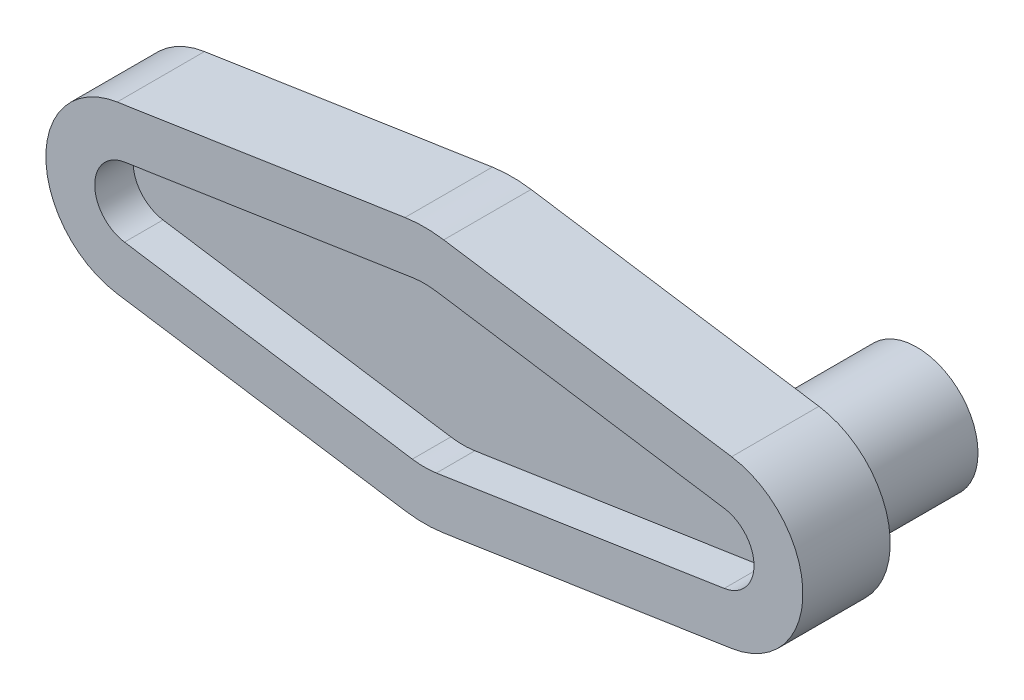
ISO-10303-21;
HEADER;
FILE_DESCRIPTION(('STEP AP214'),'2;1');
FILE_NAME('part.step','',(''),(''),'','','');
FILE_SCHEMA(('AUTOMOTIVE_DESIGN { 1 0 10303 214 1 1 1 1 }'));
ENDSEC;
DATA;
#1=APPLICATION_CONTEXT('core data for automotive mechanical design processes');
#2=APPLICATION_PROTOCOL_DEFINITION('international standard','automotive_design',2000,#1);
#3=PRODUCT_CONTEXT('',#1,'mechanical');
#4=PRODUCT('Part','Part','',(#3));
#5=PRODUCT_RELATED_PRODUCT_CATEGORY('part','',(#4));
#6=PRODUCT_DEFINITION_FORMATION('','',#4);
#7=PRODUCT_DEFINITION_CONTEXT('part definition',#1,'design');
#8=PRODUCT_DEFINITION('design','',#6,#7);
#9=PRODUCT_DEFINITION_SHAPE('','',#8);
#10=(LENGTH_UNIT() NAMED_UNIT(*) SI_UNIT(.MILLI.,.METRE.));
#11=(NAMED_UNIT(*) PLANE_ANGLE_UNIT() SI_UNIT($,.RADIAN.));
#12=(NAMED_UNIT(*) SI_UNIT($,.STERADIAN.) SOLID_ANGLE_UNIT());
#13=UNCERTAINTY_MEASURE_WITH_UNIT(LENGTH_MEASURE(1.E-05),#10,'distance_accuracy_value','');
#14=(GEOMETRIC_REPRESENTATION_CONTEXT(3) GLOBAL_UNCERTAINTY_ASSIGNED_CONTEXT((#13)) GLOBAL_UNIT_ASSIGNED_CONTEXT((#10,
#11,#12)) REPRESENTATION_CONTEXT('',''));
#15=CARTESIAN_POINT('',(0.,0.,0.));
#16=DIRECTION('',(0.,0.,1.));
#17=DIRECTION('',(1.,0.,0.));
#18=AXIS2_PLACEMENT_3D('',#15,#16,#17);
#19=CARTESIAN_POINT('',(-0.509415328671595,-3.3334105627571,-2.));
#20=DIRECTION('',(-0.151067206207441,-0.988523494515269,0.));
#21=DIRECTION('',(0.988523494515269,-0.151067206207441,0.));
#22=AXIS2_PLACEMENT_3D('',#19,#20,#21);
#23=PLANE('',#22);
#24=DIRECTION('',(-0.988523494515269,0.151067206207441,0.));
#25=VECTOR('',#24,1.);
#26=CARTESIAN_POINT('',(-0.509415328671595,-3.3334105627571,0.));
#27=LINE('',#26,#25);
#28=CARTESIAN_POINT('',(4.42533710233228,-4.08754464982064,0.));
#29=VERTEX_POINT('',#28);
#30=CARTESIAN_POINT('',(-10.5365026242203,-1.80106047442719,0.));
#31=VERTEX_POINT('',#30);
#32=EDGE_CURVE('E218',#29,#31,#27,.T.);
#33=ORIENTED_EDGE('',*,*,#32,.F.);
#34=DIRECTION('',(0.,0.,1.));
#35=VECTOR('',#34,1.);
#36=CARTESIAN_POINT('',(4.42533710233228,-4.08754464982064,-2.));
#37=LINE('',#36,#35);
#38=CARTESIAN_POINT('',(4.42533710233228,-4.08754464982064,-2.));
#39=VERTEX_POINT('',#38);
#40=EDGE_CURVE('E119',#39,#29,#37,.T.);
#41=ORIENTED_EDGE('',*,*,#40,.F.);
#42=DIRECTION('',(-0.988523494515269,0.151067206207441,0.));
#43=VECTOR('',#42,1.);
#44=CARTESIAN_POINT('',(-0.509415328671595,-3.3334105627571,-2.));
#45=LINE('',#44,#43);
#46=CARTESIAN_POINT('',(-10.5365026242203,-1.80106047442719,-2.));
#47=VERTEX_POINT('',#46);
#48=EDGE_CURVE('E124',#39,#47,#45,.T.);
#49=ORIENTED_EDGE('',*,*,#48,.T.);
#50=DIRECTION('',(0.,0.,1.));
#51=VECTOR('',#50,1.);
#52=CARTESIAN_POINT('',(-10.5365026242203,-1.80106047442719,-2.));
#53=LINE('',#52,#51);
#54=EDGE_CURVE('E11',#47,#31,#53,.T.);
#55=ORIENTED_EDGE('',*,*,#54,.T.);
#56=EDGE_LOOP('',(#33,#41,#49,#55));
#57=FACE_BOUND('',#56,.T.);
#58=ADVANCED_FACE('F43',(#57),#23,.F.);
#59=CARTESIAN_POINT('',(-10.2609482374131,0.00205743722317206,-2.));
#60=DIRECTION('',(0.,0.,1.));
#61=DIRECTION('',(-1.,0.,0.));
#62=AXIS2_PLACEMENT_3D('',#59,#60,#61);
#63=CYLINDRICAL_SURFACE('',#62,1.82405165042085);
#64=CARTESIAN_POINT('',(-10.2609482374131,0.00205743722317206,0.));
#65=DIRECTION('',(0.,0.,1.));
#66=DIRECTION('',(1.,0.,0.));
#67=AXIS2_PLACEMENT_3D('',#64,#65,#66);
#68=CIRCLE('',#67,1.82405165042085);
#69=CARTESIAN_POINT('',(-10.5360180196135,1.80524934002311,0.));
#70=VERTEX_POINT('',#69);
#71=EDGE_CURVE('E220',#31,#70,#68,.F.);
#72=ORIENTED_EDGE('',*,*,#71,.F.);
#73=ORIENTED_EDGE('',*,*,#54,.F.);
#74=CARTESIAN_POINT('',(-10.2609482374131,0.00205743722317206,-2.));
#75=DIRECTION('',(0.,0.,1.));
#76=DIRECTION('',(1.,0.,0.));
#77=AXIS2_PLACEMENT_3D('',#74,#75,#76);
#78=CIRCLE('',#77,1.82405165042085);
#79=CARTESIAN_POINT('',(-10.5360180196135,1.80524934002311,-2.));
#80=VERTEX_POINT('',#79);
#81=EDGE_CURVE('E250',#47,#80,#78,.F.);
#82=ORIENTED_EDGE('',*,*,#81,.T.);
#83=DIRECTION('',(0.,0.,1.));
#84=VECTOR('',#83,1.);
#85=CARTESIAN_POINT('',(-10.5360180196135,1.80524934002311,-2.));
#86=LINE('',#85,#84);
#87=EDGE_CURVE('E53',#80,#70,#86,.T.);
#88=ORIENTED_EDGE('',*,*,#87,.T.);
#89=EDGE_LOOP('',(#72,#73,#82,#88));
#90=FACE_BOUND('',#89,.T.);
#91=ADVANCED_FACE('F247',(#90),#63,.F.);
#92=CARTESIAN_POINT('',(-0.508721767831144,3.33487366439654,-2.));
#93=DIRECTION('',(-0.150801531380359,0.988564058689845,0.));
#94=DIRECTION('',(-0.988564058689845,-0.150801531380359,0.));
#95=AXIS2_PLACEMENT_3D('',#92,#93,#94);
#96=PLANE('',#95);
#97=DIRECTION('',(0.988564058689845,0.150801531380359,0.));
#98=VECTOR('',#97,1.);
#99=CARTESIAN_POINT('',(-0.508721767831144,3.33487366439654,0.));
#100=LINE('',#99,#98);
#101=CARTESIAN_POINT('',(4.42643566774227,4.08771238268251,0.));
#102=VERTEX_POINT('',#101);
#103=EDGE_CURVE('E223',#70,#102,#100,.T.);
#104=ORIENTED_EDGE('',*,*,#103,.F.);
#105=ORIENTED_EDGE('',*,*,#87,.F.);
#106=DIRECTION('',(0.988564058689845,0.150801531380359,0.));
#107=VECTOR('',#106,1.);
#108=CARTESIAN_POINT('',(-0.508721767831144,3.33487366439654,-2.));
#109=LINE('',#108,#107);
#110=CARTESIAN_POINT('',(4.42643566774227,4.08771238268251,-2.));
#111=VERTEX_POINT('',#110);
#112=EDGE_CURVE('E254',#80,#111,#109,.T.);
#113=ORIENTED_EDGE('',*,*,#112,.T.);
#114=DIRECTION('',(0.,0.,1.));
#115=VECTOR('',#114,1.);
#116=CARTESIAN_POINT('',(4.42643566774227,4.08771238268251,-2.));
#117=LINE('',#116,#115);
#118=EDGE_CURVE('E151',#111,#102,#117,.T.);
#119=ORIENTED_EDGE('',*,*,#118,.T.);
#120=EDGE_LOOP('',(#104,#105,#113,#119));
#121=FACE_BOUND('',#120,.T.);
#122=ADVANCED_FACE('F242',(#121),#96,.F.);
#123=CARTESIAN_POINT('',(5.05000000000001,0.,-2.));
#124=DIRECTION('',(0.,0.,1.));
#125=DIRECTION('',(-1.,0.,0.));
#126=AXIS2_PLACEMENT_3D('',#123,#124,#125);
#127=CYLINDRICAL_SURFACE('',#126,4.135);
#128=CARTESIAN_POINT('',(5.05000000000001,0.,0.));
#129=DIRECTION('',(0.,0.,1.));
#130=DIRECTION('',(1.,0.,0.));
#131=AXIS2_PLACEMENT_3D('',#128,#129,#130);
#132=CIRCLE('',#131,4.135);
#133=CARTESIAN_POINT('',(5.67356433225773,4.08771238268252,0.));
#134=VERTEX_POINT('',#133);
#135=EDGE_CURVE('E226',#134,#102,#132,.T.);
#136=ORIENTED_EDGE('',*,*,#135,.T.);
#137=ORIENTED_EDGE('',*,*,#118,.F.);
#138=CARTESIAN_POINT('',(5.05000000000001,0.,-2.));
#139=DIRECTION('',(0.,0.,1.));
#140=DIRECTION('',(1.,0.,0.));
#141=AXIS2_PLACEMENT_3D('',#138,#139,#140);
#142=CIRCLE('',#141,4.135);
#143=CARTESIAN_POINT('',(5.67356433225773,4.08771238268252,-2.));
#144=VERTEX_POINT('',#143);
#145=EDGE_CURVE('E239',#144,#111,#142,.T.);
#146=ORIENTED_EDGE('',*,*,#145,.F.);
#147=DIRECTION('',(0.,0.,1.));
#148=VECTOR('',#147,1.);
#149=CARTESIAN_POINT('',(5.67356433225773,4.08771238268252,-2.));
#150=LINE('',#149,#148);
#151=EDGE_CURVE('E148',#144,#134,#150,.T.);
#152=ORIENTED_EDGE('',*,*,#151,.T.);
#153=EDGE_LOOP('',(#136,#137,#146,#152));
#154=FACE_BOUND('',#153,.T.);
#155=ADVANCED_FACE('F236',(#154),#127,.F.);
#156=CARTESIAN_POINT('',(0.738406896684348,4.84055110096841,-2.));
#157=DIRECTION('',(-0.150801531380345,-0.988564058689847,0.));
#158=DIRECTION('',(0.988564058689847,-0.150801531380345,0.));
#159=AXIS2_PLACEMENT_3D('',#156,#157,#158);
#160=PLANE('',#159);
#161=DIRECTION('',(-0.988564058689847,0.150801531380345,0.));
#162=VECTOR('',#161,1.);
#163=CARTESIAN_POINT('',(0.738406896684348,4.84055110096841,0.));
#164=LINE('',#163,#162);
#165=CARTESIAN_POINT('',(20.6360180196135,1.80524934002333,0.));
#166=VERTEX_POINT('',#165);
#167=EDGE_CURVE('E139',#166,#134,#164,.T.);
#168=ORIENTED_EDGE('',*,*,#167,.T.);
#169=ORIENTED_EDGE('',*,*,#151,.F.);
#170=DIRECTION('',(-0.988564058689847,0.150801531380345,0.));
#171=VECTOR('',#170,1.);
#172=CARTESIAN_POINT('',(0.738406896684348,4.84055110096841,-2.));
#173=LINE('',#172,#171);
#174=CARTESIAN_POINT('',(20.6360180196135,1.80524934002333,-2.));
#175=VERTEX_POINT('',#174);
#176=EDGE_CURVE('E260',#175,#144,#173,.T.);
#177=ORIENTED_EDGE('',*,*,#176,.F.);
#178=DIRECTION('',(0.,0.,1.));
#179=VECTOR('',#178,1.);
#180=CARTESIAN_POINT('',(20.6360180196135,1.80524934002333,-2.));
#181=LINE('',#180,#179);
#182=EDGE_CURVE('E145',#175,#166,#181,.T.);
#183=ORIENTED_EDGE('',*,*,#182,.T.);
#184=EDGE_LOOP('',(#168,#169,#177,#183));
#185=FACE_BOUND('',#184,.T.);
#186=ADVANCED_FACE('F229',(#185),#160,.T.);
#187=CARTESIAN_POINT('',(20.3609482374132,0.00205743722338716,-2.));
#188=DIRECTION('',(0.,0.,1.));
#189=DIRECTION('',(-1.,0.,0.));
#190=AXIS2_PLACEMENT_3D('',#187,#188,#189);
#191=CYLINDRICAL_SURFACE('',#190,1.82405165042085);
#192=CARTESIAN_POINT('',(20.3609482374132,0.00205743722338716,0.));
#193=DIRECTION('',(0.,0.,1.));
#194=DIRECTION('',(1.,0.,0.));
#195=AXIS2_PLACEMENT_3D('',#192,#193,#194);
#196=CIRCLE('',#195,1.82405165042085);
#197=CARTESIAN_POINT('',(20.6365026242203,-1.80106047442697,0.));
#198=VERTEX_POINT('',#197);
#199=EDGE_CURVE('E137',#198,#166,#196,.T.);
#200=ORIENTED_EDGE('',*,*,#199,.T.);
#201=ORIENTED_EDGE('',*,*,#182,.F.);
#202=CARTESIAN_POINT('',(20.3609482374132,0.00205743722338716,-2.));
#203=DIRECTION('',(0.,0.,1.));
#204=DIRECTION('',(1.,0.,0.));
#205=AXIS2_PLACEMENT_3D('',#202,#203,#204);
#206=CIRCLE('',#205,1.82405165042085);
#207=CARTESIAN_POINT('',(20.6365026242203,-1.80106047442697,-2.));
#208=VERTEX_POINT('',#207);
#209=EDGE_CURVE('E263',#208,#175,#206,.T.);
#210=ORIENTED_EDGE('',*,*,#209,.F.);
#211=DIRECTION('',(0.,0.,1.));
#212=VECTOR('',#211,1.);
#213=CARTESIAN_POINT('',(20.6365026242203,-1.80106047442697,-2.));
#214=LINE('',#213,#212);
#215=EDGE_CURVE('E132',#208,#198,#214,.T.);
#216=ORIENTED_EDGE('',*,*,#215,.T.);
#217=EDGE_LOOP('',(#200,#201,#210,#216));
#218=FACE_BOUND('',#217,.T.);
#219=ADVANCED_FACE('F272',(#218),#191,.F.);
#220=CARTESIAN_POINT('',(0.739910466664021,-4.84167873688423,-2.));
#221=DIRECTION('',(-0.151067206207455,0.988523494515267,0.));
#222=DIRECTION('',(-0.988523494515267,-0.151067206207455,0.));
#223=AXIS2_PLACEMENT_3D('',#220,#221,#222);
#224=PLANE('',#223);
#225=DIRECTION('',(0.988523494515267,0.151067206207455,0.));
#226=VECTOR('',#225,1.);
#227=CARTESIAN_POINT('',(0.739910466664021,-4.84167873688423,0.));
#228=LINE('',#227,#226);
#229=CARTESIAN_POINT('',(5.67466289766783,-4.08754464982063,0.));
#230=VERTEX_POINT('',#229);
#231=EDGE_CURVE('E125',#230,#198,#228,.T.);
#232=ORIENTED_EDGE('',*,*,#231,.T.);
#233=ORIENTED_EDGE('',*,*,#215,.F.);
#234=DIRECTION('',(0.988523494515267,0.151067206207455,0.));
#235=VECTOR('',#234,1.);
#236=CARTESIAN_POINT('',(0.739910466664021,-4.84167873688423,-2.));
#237=LINE('',#236,#235);
#238=CARTESIAN_POINT('',(5.67466289766783,-4.08754464982063,-2.));
#239=VERTEX_POINT('',#238);
#240=EDGE_CURVE('E131',#239,#208,#237,.T.);
#241=ORIENTED_EDGE('',*,*,#240,.F.);
#242=DIRECTION('',(0.,0.,1.));
#243=VECTOR('',#242,1.);
#244=CARTESIAN_POINT('',(5.67466289766783,-4.08754464982063,-2.));
#245=LINE('',#244,#243);
#246=EDGE_CURVE('E116',#239,#230,#245,.T.);
#247=ORIENTED_EDGE('',*,*,#246,.T.);
#248=EDGE_LOOP('',(#232,#233,#241,#247));
#249=FACE_BOUND('',#248,.T.);
#250=ADVANCED_FACE('F128',(#249),#224,.T.);
#251=CARTESIAN_POINT('',(-10.2609482374131,0.00205743722317206,-2.));
#252=DIRECTION('',(0.,0.,1.));
#253=DIRECTION('',(-1.,0.,0.));
#254=AXIS2_PLACEMENT_3D('',#251,#252,#253);
#255=CYLINDRICAL_SURFACE('',#254,4.36405165042085);
#256=CARTESIAN_POINT('',(-10.2609482374131,0.00205743722317206,0.));
#257=DIRECTION('',(0.,0.,1.));
#258=DIRECTION('',(1.,0.,0.));
#259=AXIS2_PLACEMENT_3D('',#256,#257,#258);
#260=CIRCLE('',#259,4.36405165042085);
#261=CARTESIAN_POINT('',(-10.9202133279872,-4.31191015049597,0.));
#262=VERTEX_POINT('',#261);
#263=CARTESIAN_POINT('',(-10.9190539093196,4.31620204909532,0.));
#264=VERTEX_POINT('',#263);
#265=EDGE_CURVE('E186',#262,#264,#260,.F.);
#266=ORIENTED_EDGE('',*,*,#265,.T.);
#267=DIRECTION('',(0.,0.,1.));
#268=VECTOR('',#267,1.);
#269=CARTESIAN_POINT('',(-10.9190539093196,4.31620204909532,-2.));
#270=LINE('',#269,#268);
#271=CARTESIAN_POINT('',(-10.9190539093196,4.31620204909532,-4.54));
#272=VERTEX_POINT('',#271);
#273=EDGE_CURVE('E156',#272,#264,#270,.T.);
#274=ORIENTED_EDGE('',*,*,#273,.F.);
#275=CARTESIAN_POINT('',(-10.2609482374131,0.00205743722317206,-4.54));
#276=DIRECTION('',(0.,0.,1.));
#277=DIRECTION('',(1.,0.,0.));
#278=AXIS2_PLACEMENT_3D('',#275,#276,#277);
#279=CIRCLE('',#278,4.36405165042085);
#280=CARTESIAN_POINT('',(-10.9202133279872,-4.31191015049597,-4.54));
#281=VERTEX_POINT('',#280);
#282=EDGE_CURVE('E189',#272,#281,#279,.T.);
#283=ORIENTED_EDGE('',*,*,#282,.T.);
#284=DIRECTION('',(0.,0.,1.));
#285=VECTOR('',#284,1.);
#286=CARTESIAN_POINT('',(-10.9202133279872,-4.31191015049597,-2.));
#287=LINE('',#286,#285);
#288=EDGE_CURVE('E47',#281,#262,#287,.T.);
#289=ORIENTED_EDGE('',*,*,#288,.T.);
#290=EDGE_LOOP('',(#266,#274,#283,#289));
#291=FACE_BOUND('',#290,.T.);
#292=ADVANCED_FACE('F45',(#291),#255,.T.);
#293=CARTESIAN_POINT('',(-0.893126032438493,-5.84426023882588,-2.));
#294=DIRECTION('',(-0.151067206207441,-0.988523494515269,0.));
#295=DIRECTION('',(0.988523494515269,-0.151067206207441,0.));
#296=AXIS2_PLACEMENT_3D('',#293,#294,#295);
#297=PLANE('',#296);
#298=DIRECTION('',(-0.988523494515269,0.151067206207441,0.));
#299=VECTOR('',#298,1.);
#300=CARTESIAN_POINT('',(-0.893126032438493,-5.84426023882588,0.));
#301=LINE('',#300,#299);
#302=CARTESIAN_POINT('',(4.04162639856539,-6.59839432588942,0.));
#303=VERTEX_POINT('',#302);
#304=EDGE_CURVE('E192',#303,#262,#301,.T.);
#305=ORIENTED_EDGE('',*,*,#304,.T.);
#306=ORIENTED_EDGE('',*,*,#288,.F.);
#307=DIRECTION('',(0.988523494515269,-0.151067206207441,0.));
#308=VECTOR('',#307,1.);
#309=CARTESIAN_POINT('',(-0.893126032438493,-5.84426023882588,-4.54));
#310=LINE('',#309,#308);
#311=CARTESIAN_POINT('',(4.04162639856538,-6.59839432588942,-4.54));
#312=VERTEX_POINT('',#311);
#313=EDGE_CURVE('E308',#281,#312,#310,.T.);
#314=ORIENTED_EDGE('',*,*,#313,.T.);
#315=DIRECTION('',(0.,0.,1.));
#316=VECTOR('',#315,1.);
#317=CARTESIAN_POINT('',(4.04162639856539,-6.59839432588942,-2.));
#318=LINE('',#317,#316);
#319=EDGE_CURVE('E173',#312,#303,#318,.T.);
#320=ORIENTED_EDGE('',*,*,#319,.T.);
#321=EDGE_LOOP('',(#305,#306,#314,#320));
#322=FACE_BOUND('',#321,.T.);
#323=ADVANCED_FACE('F337',(#322),#297,.T.);
#324=CARTESIAN_POINT('',(5.05000000000001,0.,-2.));
#325=DIRECTION('',(0.,0.,1.));
#326=DIRECTION('',(-1.,0.,0.));
#327=AXIS2_PLACEMENT_3D('',#324,#325,#326);
#328=CYLINDRICAL_SURFACE('',#327,6.675);
#329=CARTESIAN_POINT('',(5.05000000000001,0.,0.));
#330=DIRECTION('',(0.,0.,1.));
#331=DIRECTION('',(1.,0.,0.));
#332=AXIS2_PLACEMENT_3D('',#329,#330,#331);
#333=CIRCLE('',#332,6.675);
#334=CARTESIAN_POINT('',(6.05837360143477,-6.59839432588941,0.));
#335=VERTEX_POINT('',#334);
#336=EDGE_CURVE('E197',#303,#335,#333,.T.);
#337=ORIENTED_EDGE('',*,*,#336,.F.);
#338=ORIENTED_EDGE('',*,*,#319,.F.);
#339=CARTESIAN_POINT('',(5.05000000000001,0.,-4.54));
#340=DIRECTION('',(0.,0.,1.));
#341=DIRECTION('',(1.,0.,0.));
#342=AXIS2_PLACEMENT_3D('',#339,#340,#341);
#343=CIRCLE('',#342,6.675);
#344=CARTESIAN_POINT('',(6.05837360143477,-6.59839432588941,-4.54));
#345=VERTEX_POINT('',#344);
#346=EDGE_CURVE('E310',#312,#345,#343,.T.);
#347=ORIENTED_EDGE('',*,*,#346,.T.);
#348=DIRECTION('',(0.,0.,1.));
#349=VECTOR('',#348,1.);
#350=CARTESIAN_POINT('',(6.05837360143477,-6.59839432588941,-2.));
#351=LINE('',#350,#349);
#352=EDGE_CURVE('E171',#345,#335,#351,.T.);
#353=ORIENTED_EDGE('',*,*,#352,.T.);
#354=EDGE_LOOP('',(#337,#338,#347,#353));
#355=FACE_BOUND('',#354,.T.);
#356=ADVANCED_FACE('F336',(#355),#328,.T.);
#357=CARTESIAN_POINT('',(1.12362117043096,-7.35252841295301,-2.));
#358=DIRECTION('',(-0.151067206207455,0.988523494515267,0.));
#359=DIRECTION('',(-0.988523494515267,-0.151067206207455,0.));
#360=AXIS2_PLACEMENT_3D('',#357,#358,#359);
#361=PLANE('',#360);
#362=DIRECTION('',(0.988523494515267,0.151067206207455,0.));
#363=VECTOR('',#362,1.);
#364=CARTESIAN_POINT('',(1.12362117043096,-7.35252841295301,0.));
#365=LINE('',#364,#363);
#366=CARTESIAN_POINT('',(21.0202133279873,-4.31191015049575,0.));
#367=VERTEX_POINT('',#366);
#368=EDGE_CURVE('E206',#335,#367,#365,.T.);
#369=ORIENTED_EDGE('',*,*,#368,.F.);
#370=ORIENTED_EDGE('',*,*,#352,.F.);
#371=DIRECTION('',(0.988523494515267,0.151067206207455,0.));
#372=VECTOR('',#371,1.);
#373=CARTESIAN_POINT('',(1.12362117043096,-7.35252841295301,-4.54));
#374=LINE('',#373,#372);
#375=CARTESIAN_POINT('',(21.0202133279873,-4.31191015049575,-4.54));
#376=VERTEX_POINT('',#375);
#377=EDGE_CURVE('E316',#345,#376,#374,.T.);
#378=ORIENTED_EDGE('',*,*,#377,.T.);
#379=DIRECTION('',(0.,0.,1.));
#380=VECTOR('',#379,1.);
#381=CARTESIAN_POINT('',(21.0202133279873,-4.31191015049575,-2.));
#382=LINE('',#381,#380);
#383=EDGE_CURVE('E168',#376,#367,#382,.T.);
#384=ORIENTED_EDGE('',*,*,#383,.T.);
#385=EDGE_LOOP('',(#369,#370,#378,#384));
#386=FACE_BOUND('',#385,.T.);
#387=ADVANCED_FACE('F334',(#386),#361,.F.);
#388=CARTESIAN_POINT('',(20.3609482374132,0.00205743722338716,-2.));
#389=DIRECTION('',(0.,0.,1.));
#390=DIRECTION('',(-1.,0.,0.));
#391=AXIS2_PLACEMENT_3D('',#388,#389,#390);
#392=CYLINDRICAL_SURFACE('',#391,4.36405165042085);
#393=CARTESIAN_POINT('',(20.3609482374132,0.00205743722338716,0.));
#394=DIRECTION('',(0.,0.,1.));
#395=DIRECTION('',(1.,0.,0.));
#396=AXIS2_PLACEMENT_3D('',#393,#394,#395);
#397=CIRCLE('',#396,4.36405165042085);
#398=CARTESIAN_POINT('',(21.0190539093196,4.31620204909554,0.));
#399=VERTEX_POINT('',#398);
#400=EDGE_CURVE('E209',#367,#399,#397,.T.);
#401=ORIENTED_EDGE('',*,*,#400,.F.);
#402=ORIENTED_EDGE('',*,*,#383,.F.);
#403=CARTESIAN_POINT('',(20.3609482374132,0.00205743722338716,-4.54));
#404=DIRECTION('',(0.,0.,1.));
#405=DIRECTION('',(1.,0.,0.));
#406=AXIS2_PLACEMENT_3D('',#403,#404,#405);
#407=CIRCLE('',#406,4.36405165042085);
#408=CARTESIAN_POINT('',(21.0190539093196,4.31620204909554,-4.54));
#409=VERTEX_POINT('',#408);
#410=EDGE_CURVE('E319',#376,#409,#407,.T.);
#411=ORIENTED_EDGE('',*,*,#410,.T.);
#412=DIRECTION('',(0.,0.,1.));
#413=VECTOR('',#412,1.);
#414=CARTESIAN_POINT('',(21.0190539093196,4.31620204909554,-2.));
#415=LINE('',#414,#413);
#416=EDGE_CURVE('E165',#409,#399,#415,.T.);
#417=ORIENTED_EDGE('',*,*,#416,.T.);
#418=EDGE_LOOP('',(#401,#402,#411,#417));
#419=FACE_BOUND('',#418,.T.);
#420=ADVANCED_FACE('F331',(#419),#392,.T.);
#421=CARTESIAN_POINT('',(1.12144278639042,7.35150381004062,-2.));
#422=DIRECTION('',(-0.150801531380345,-0.988564058689847,0.));
#423=DIRECTION('',(0.988564058689847,-0.150801531380345,0.));
#424=AXIS2_PLACEMENT_3D('',#421,#422,#423);
#425=PLANE('',#424);
#426=DIRECTION('',(-0.988564058689847,0.150801531380345,0.));
#427=VECTOR('',#426,1.);
#428=CARTESIAN_POINT('',(1.12144278639042,7.35150381004062,0.));
#429=LINE('',#428,#427);
#430=CARTESIAN_POINT('',(6.05660022196381,6.59866509175473,0.));
#431=VERTEX_POINT('',#430);
#432=EDGE_CURVE('E212',#399,#431,#429,.T.);
#433=ORIENTED_EDGE('',*,*,#432,.F.);
#434=ORIENTED_EDGE('',*,*,#416,.F.);
#435=DIRECTION('',(-0.988564058689847,0.150801531380345,0.));
#436=VECTOR('',#435,1.);
#437=CARTESIAN_POINT('',(1.12144278639042,7.35150381004062,-4.54));
#438=LINE('',#437,#436);
#439=CARTESIAN_POINT('',(6.05660022196381,6.59866509175473,-4.54));
#440=VERTEX_POINT('',#439);
#441=EDGE_CURVE('E200',#409,#440,#438,.T.);
#442=ORIENTED_EDGE('',*,*,#441,.T.);
#443=DIRECTION('',(0.,0.,1.));
#444=VECTOR('',#443,1.);
#445=CARTESIAN_POINT('',(6.05660022196381,6.59866509175473,-2.));
#446=LINE('',#445,#444);
#447=EDGE_CURVE('E162',#440,#431,#446,.T.);
#448=ORIENTED_EDGE('',*,*,#447,.T.);
#449=EDGE_LOOP('',(#433,#434,#442,#448));
#450=FACE_BOUND('',#449,.T.);
#451=ADVANCED_FACE('F325',(#450),#425,.F.);
#452=CARTESIAN_POINT('',(5.05000000000001,0.,-2.));
#453=DIRECTION('',(0.,0.,1.));
#454=DIRECTION('',(-1.,0.,0.));
#455=AXIS2_PLACEMENT_3D('',#452,#453,#454);
#456=CYLINDRICAL_SURFACE('',#455,6.675);
#457=CARTESIAN_POINT('',(5.05000000000001,0.,0.));
#458=DIRECTION('',(0.,0.,1.));
#459=DIRECTION('',(1.,0.,0.));
#460=AXIS2_PLACEMENT_3D('',#457,#458,#459);
#461=CIRCLE('',#460,6.675);
#462=CARTESIAN_POINT('',(4.04339977803616,6.59866509175472,0.));
#463=VERTEX_POINT('',#462);
#464=EDGE_CURVE('E215',#431,#463,#461,.T.);
#465=ORIENTED_EDGE('',*,*,#464,.F.);
#466=ORIENTED_EDGE('',*,*,#447,.F.);
#467=CARTESIAN_POINT('',(5.05000000000001,0.,-4.54));
#468=DIRECTION('',(0.,0.,1.));
#469=DIRECTION('',(1.,0.,0.));
#470=AXIS2_PLACEMENT_3D('',#467,#468,#469);
#471=CIRCLE('',#470,6.675);
#472=CARTESIAN_POINT('',(4.04339977803616,6.59866509175472,-4.54));
#473=VERTEX_POINT('',#472);
#474=EDGE_CURVE('E195',#440,#473,#471,.T.);
#475=ORIENTED_EDGE('',*,*,#474,.T.);
#476=DIRECTION('',(0.,0.,1.));
#477=VECTOR('',#476,1.);
#478=CARTESIAN_POINT('',(4.04339977803616,6.59866509175472,-2.));
#479=LINE('',#478,#477);
#480=EDGE_CURVE('E159',#473,#463,#479,.T.);
#481=ORIENTED_EDGE('',*,*,#480,.T.);
#482=EDGE_LOOP('',(#465,#466,#475,#481));
#483=FACE_BOUND('',#482,.T.);
#484=ADVANCED_FACE('F329',(#483),#456,.T.);
#485=CARTESIAN_POINT('',(-0.891757657537256,5.84582637346875,-2.));
#486=DIRECTION('',(-0.150801531380359,0.988564058689845,0.));
#487=DIRECTION('',(-0.988564058689845,-0.150801531380359,0.));
#488=AXIS2_PLACEMENT_3D('',#485,#486,#487);
#489=PLANE('',#488);
#490=DIRECTION('',(0.988564058689845,0.150801531380359,0.));
#491=VECTOR('',#490,1.);
#492=CARTESIAN_POINT('',(-0.891757657537256,5.84582637346875,0.));
#493=LINE('',#492,#491);
#494=EDGE_CURVE('E194',#264,#463,#493,.T.);
#495=ORIENTED_EDGE('',*,*,#494,.T.);
#496=ORIENTED_EDGE('',*,*,#480,.F.);
#497=DIRECTION('',(-0.988564058689845,-0.150801531380359,0.));
#498=VECTOR('',#497,1.);
#499=CARTESIAN_POINT('',(-0.891757657537256,5.84582637346875,-4.54));
#500=LINE('',#499,#498);
#501=EDGE_CURVE('E302',#473,#272,#500,.T.);
#502=ORIENTED_EDGE('',*,*,#501,.T.);
#503=ORIENTED_EDGE('',*,*,#273,.T.);
#504=EDGE_LOOP('',(#495,#496,#502,#503));
#505=FACE_BOUND('',#504,.T.);
#506=ADVANCED_FACE('F303',(#505),#489,.T.);
#507=CARTESIAN_POINT('',(5.05000000000001,0.,-2.));
#508=DIRECTION('',(0.,0.,1.));
#509=DIRECTION('',(-1.,0.,0.));
#510=AXIS2_PLACEMENT_3D('',#507,#508,#509);
#511=CYLINDRICAL_SURFACE('',#510,4.135);
#512=CARTESIAN_POINT('',(5.05000000000001,0.,0.));
#513=DIRECTION('',(0.,0.,1.));
#514=DIRECTION('',(1.,0.,0.));
#515=AXIS2_PLACEMENT_3D('',#512,#513,#514);
#516=CIRCLE('',#515,4.135);
#517=EDGE_CURVE('E113',#29,#230,#516,.T.);
#518=ORIENTED_EDGE('',*,*,#517,.T.);
#519=ORIENTED_EDGE('',*,*,#246,.F.);
#520=CARTESIAN_POINT('',(5.05000000000001,0.,-2.));
#521=DIRECTION('',(0.,0.,1.));
#522=DIRECTION('',(1.,0.,0.));
#523=AXIS2_PLACEMENT_3D('',#520,#521,#522);
#524=CIRCLE('',#523,4.135);
#525=EDGE_CURVE('E61',#39,#239,#524,.T.);
#526=ORIENTED_EDGE('',*,*,#525,.F.);
#527=ORIENTED_EDGE('',*,*,#40,.T.);
#528=EDGE_LOOP('',(#518,#519,#526,#527));
#529=FACE_BOUND('',#528,.T.);
#530=ADVANCED_FACE('F115',(#529),#511,.F.);
#531=CARTESIAN_POINT('',(0.,0.,0.));
#532=DIRECTION('',(0.,0.,-1.));
#533=DIRECTION('',(1.,0.,0.));
#534=AXIS2_PLACEMENT_3D('',#531,#532,#533);
#535=PLANE('',#534);
#536=ORIENTED_EDGE('',*,*,#265,.F.);
#537=ORIENTED_EDGE('',*,*,#304,.F.);
#538=ORIENTED_EDGE('',*,*,#336,.T.);
#539=ORIENTED_EDGE('',*,*,#368,.T.);
#540=ORIENTED_EDGE('',*,*,#400,.T.);
#541=ORIENTED_EDGE('',*,*,#432,.T.);
#542=ORIENTED_EDGE('',*,*,#464,.T.);
#543=ORIENTED_EDGE('',*,*,#494,.F.);
#544=EDGE_LOOP('',(#536,#537,#538,#539,#540,#541,#542,#543));
#545=FACE_BOUND('',#544,.T.);
#546=ORIENTED_EDGE('',*,*,#32,.T.);
#547=ORIENTED_EDGE('',*,*,#71,.T.);
#548=ORIENTED_EDGE('',*,*,#103,.T.);
#549=ORIENTED_EDGE('',*,*,#135,.F.);
#550=ORIENTED_EDGE('',*,*,#167,.F.);
#551=ORIENTED_EDGE('',*,*,#199,.F.);
#552=ORIENTED_EDGE('',*,*,#231,.F.);
#553=ORIENTED_EDGE('',*,*,#517,.F.);
#554=EDGE_LOOP('',(#546,#547,#548,#549,#550,#551,#552,#553));
#555=FACE_BOUND('',#554,.T.);
#556=ADVANCED_FACE('F135',(#545,#555),#535,.F.);
#557=CARTESIAN_POINT('',(0.,0.,-2.));
#558=DIRECTION('',(0.,0.,-1.));
#559=DIRECTION('',(1.,0.,0.));
#560=AXIS2_PLACEMENT_3D('',#557,#558,#559);
#561=PLANE('',#560);
#562=ORIENTED_EDGE('',*,*,#525,.T.);
#563=ORIENTED_EDGE('',*,*,#240,.T.);
#564=ORIENTED_EDGE('',*,*,#209,.T.);
#565=ORIENTED_EDGE('',*,*,#176,.T.);
#566=ORIENTED_EDGE('',*,*,#145,.T.);
#567=ORIENTED_EDGE('',*,*,#112,.F.);
#568=ORIENTED_EDGE('',*,*,#81,.F.);
#569=ORIENTED_EDGE('',*,*,#48,.F.);
#570=EDGE_LOOP('',(#562,#563,#564,#565,#566,#567,#568,#569));
#571=FACE_BOUND('',#570,.T.);
#572=ADVANCED_FACE('F266',(#571),#561,.F.);
#573=CARTESIAN_POINT('',(0.,0.,-4.54));
#574=DIRECTION('',(0.,0.,-1.));
#575=DIRECTION('',(1.,0.,0.));
#576=AXIS2_PLACEMENT_3D('',#573,#574,#575);
#577=PLANE('',#576);
#578=CARTESIAN_POINT('',(19.7613114684991,0.,-4.54));
#579=DIRECTION('',(0.,0.,1.));
#580=DIRECTION('',(1.,0.,0.));
#581=AXIS2_PLACEMENT_3D('',#578,#579,#580);
#582=CIRCLE('',#581,3.175);
#583=CARTESIAN_POINT('',(22.9363114684991,0.,-4.54));
#584=VERTEX_POINT('',#583);
#585=EDGE_CURVE('E563',#584,#584,#582,.T.);
#586=ORIENTED_EDGE('',*,*,#585,.T.);
#587=EDGE_LOOP('',(#586));
#588=FACE_BOUND('',#587,.T.);
#589=ORIENTED_EDGE('',*,*,#501,.F.);
#590=ORIENTED_EDGE('',*,*,#474,.F.);
#591=ORIENTED_EDGE('',*,*,#441,.F.);
#592=ORIENTED_EDGE('',*,*,#410,.F.);
#593=ORIENTED_EDGE('',*,*,#377,.F.);
#594=ORIENTED_EDGE('',*,*,#346,.F.);
#595=ORIENTED_EDGE('',*,*,#313,.F.);
#596=ORIENTED_EDGE('',*,*,#282,.F.);
#597=EDGE_LOOP('',(#589,#590,#591,#592,#593,#594,#595,#596));
#598=FACE_BOUND('',#597,.T.);
#599=ADVANCED_FACE('F307',(#588,#598),#577,.T.);
#600=CARTESIAN_POINT('',(19.7613114684991,0.,-10.89));
#601=DIRECTION('',(0.,0.,1.));
#602=DIRECTION('',(-1.,0.,0.));
#603=AXIS2_PLACEMENT_3D('',#600,#601,#602);
#604=CYLINDRICAL_SURFACE('',#603,3.175);
#605=CARTESIAN_POINT('',(19.7613114684991,0.,-10.89));
#606=DIRECTION('',(0.,0.,1.));
#607=DIRECTION('',(1.,0.,0.));
#608=AXIS2_PLACEMENT_3D('',#605,#606,#607);
#609=CIRCLE('',#608,3.175);
#610=CARTESIAN_POINT('',(22.9363114684991,0.,-10.89));
#611=VERTEX_POINT('',#610);
#612=EDGE_CURVE('E305',#611,#611,#609,.T.);
#613=ORIENTED_EDGE('',*,*,#612,.T.);
#614=EDGE_LOOP('',(#613));
#615=FACE_BOUND('',#614,.T.);
#616=ORIENTED_EDGE('',*,*,#585,.F.);
#617=EDGE_LOOP('',(#616));
#618=FACE_BOUND('',#617,.T.);
#619=ADVANCED_FACE('F418',(#615,#618),#604,.T.);
#620=CARTESIAN_POINT('',(19.7613114684991,0.,-10.89));
#621=DIRECTION('',(0.,0.,-1.));
#622=DIRECTION('',(1.,0.,0.));
#623=AXIS2_PLACEMENT_3D('',#620,#621,#622);
#624=PLANE('',#623);
#625=ORIENTED_EDGE('',*,*,#612,.F.);
#626=EDGE_LOOP('',(#625));
#627=FACE_BOUND('',#626,.T.);
#628=ADVANCED_FACE('F427',(#627),#624,.T.);
#629=CLOSED_SHELL('',(#58,#91,#122,#155,#186,#219,#250,#292,#323,#356,#387,#420,#451,#484,#506,
#530,#556,#572,#599,#619,#628));
#630=MANIFOLD_SOLID_BREP('B2',#629);
#631=ADVANCED_BREP_SHAPE_REPRESENTATION('',(#18,#630),#14);
#632=SHAPE_DEFINITION_REPRESENTATION(#9,#631);
ENDSEC;
END-ISO-10303-21;
